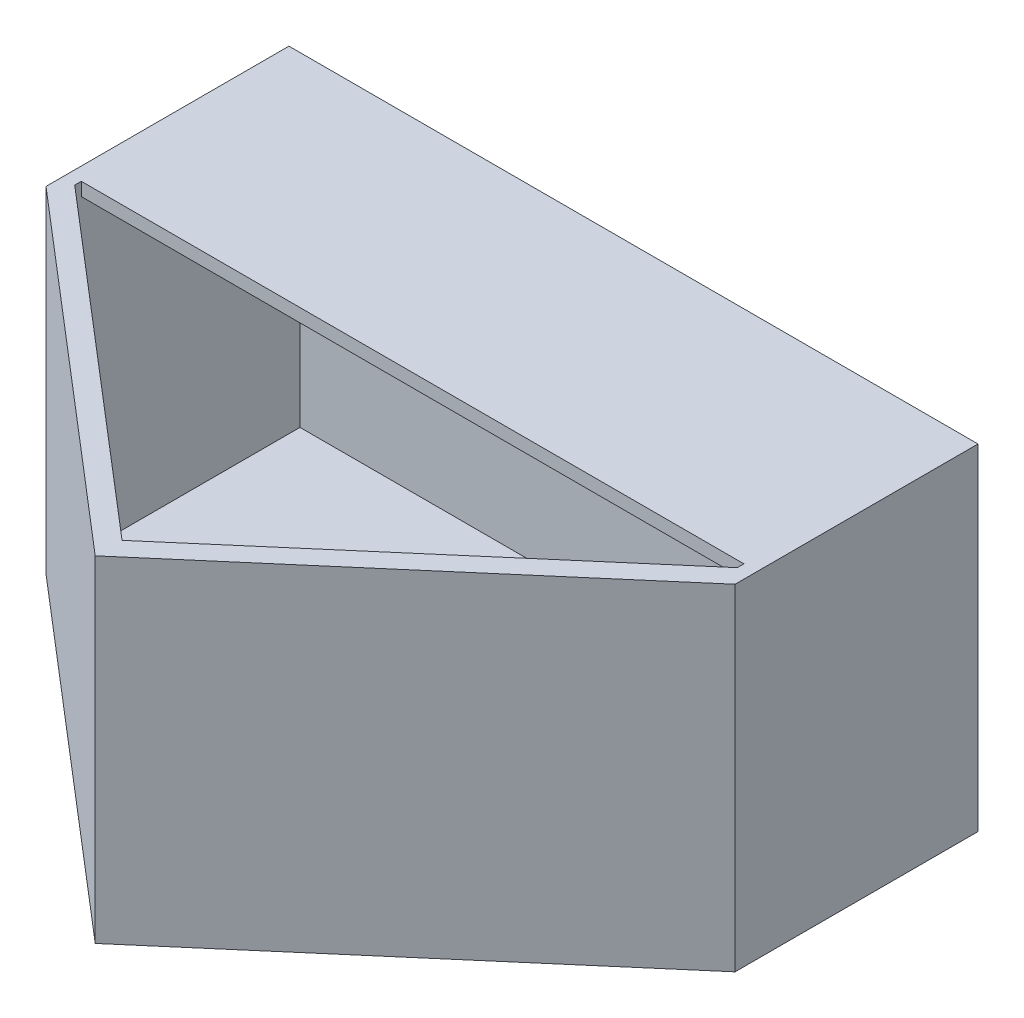
ISO-10303-21;
HEADER;
FILE_DESCRIPTION(('STEP AP214'),'2;1');
FILE_NAME('part.step','',(''),(''),'','','');
FILE_SCHEMA(('AUTOMOTIVE_DESIGN { 1 0 10303 214 1 1 1 1 }'));
ENDSEC;
DATA;
#1=APPLICATION_CONTEXT('core data for automotive mechanical design processes');
#2=APPLICATION_PROTOCOL_DEFINITION('international standard','automotive_design',2000,#1);
#3=PRODUCT_CONTEXT('',#1,'mechanical');
#4=PRODUCT('Part','Part','',(#3));
#5=PRODUCT_RELATED_PRODUCT_CATEGORY('part','',(#4));
#6=PRODUCT_DEFINITION_FORMATION('','',#4);
#7=PRODUCT_DEFINITION_CONTEXT('part definition',#1,'design');
#8=PRODUCT_DEFINITION('design','',#6,#7);
#9=PRODUCT_DEFINITION_SHAPE('','',#8);
#10=(LENGTH_UNIT() NAMED_UNIT(*) SI_UNIT(.MILLI.,.METRE.));
#11=(NAMED_UNIT(*) PLANE_ANGLE_UNIT() SI_UNIT($,.RADIAN.));
#12=(NAMED_UNIT(*) SI_UNIT($,.STERADIAN.) SOLID_ANGLE_UNIT());
#13=UNCERTAINTY_MEASURE_WITH_UNIT(LENGTH_MEASURE(1.E-05),#10,'distance_accuracy_value','');
#14=(GEOMETRIC_REPRESENTATION_CONTEXT(3) GLOBAL_UNCERTAINTY_ASSIGNED_CONTEXT((#13)) GLOBAL_UNIT_ASSIGNED_CONTEXT((#10,
#11,#12)) REPRESENTATION_CONTEXT('',''));
#15=CARTESIAN_POINT('',(0.,0.,0.));
#16=DIRECTION('',(0.,0.,1.));
#17=DIRECTION('',(1.,0.,0.));
#18=AXIS2_PLACEMENT_3D('',#15,#16,#17);
#19=CARTESIAN_POINT('',(-489.308820700797,463.006069764868,1627.20245723625));
#20=DIRECTION('',(0.650791373455967,0.,0.759256602365298));
#21=DIRECTION('',(0.759256602365298,0.,-0.650791373455967));
#22=AXIS2_PLACEMENT_3D('',#19,#20,#21);
#23=PLANE('',#22);
#24=DIRECTION('',(-0.759256602365298,0.,0.650791373455967));
#25=VECTOR('',#24,1.);
#26=CARTESIAN_POINT('',(-404.09321667027,-266.993930235132,1554.16051092437));
#27=LINE('',#26,#25);
#28=CARTESIAN_POINT('',(808.260712741496,-266.993930235132,515.));
#29=VERTEX_POINT('',#28);
#30=CARTESIAN_POINT('',(58.2607127414948,-266.993930235132,1157.85714285714));
#31=VERTEX_POINT('',#30);
#32=EDGE_CURVE('E142',#29,#31,#27,.T.);
#33=ORIENTED_EDGE('',*,*,#32,.T.);
#34=DIRECTION('',(0.,1.,0.));
#35=VECTOR('',#34,1.);
#36=CARTESIAN_POINT('',(58.2607127414948,-296.993930235132,1157.85714285714));
#37=LINE('',#36,#35);
#38=CARTESIAN_POINT('',(58.2607127414949,463.006069764868,1157.85714285714));
#39=VERTEX_POINT('',#38);
#40=EDGE_CURVE('E128',#31,#39,#37,.T.);
#41=ORIENTED_EDGE('',*,*,#40,.T.);
#42=DIRECTION('',(0.759256602365298,0.,-0.650791373455967));
#43=VECTOR('',#42,1.);
#44=CARTESIAN_POINT('',(-489.308820700797,463.006069764868,1627.20245723625));
#45=LINE('',#44,#43);
#46=CARTESIAN_POINT('',(808.260712741496,463.006069764868,515.));
#47=VERTEX_POINT('',#46);
#48=EDGE_CURVE('E168',#39,#47,#45,.T.);
#49=ORIENTED_EDGE('',*,*,#48,.T.);
#50=DIRECTION('',(0.,1.,0.));
#51=VECTOR('',#50,1.);
#52=CARTESIAN_POINT('',(808.260712741496,-296.994930235132,515.));
#53=LINE('',#52,#51);
#54=EDGE_CURVE('E143',#29,#47,#53,.T.);
#55=ORIENTED_EDGE('',*,*,#54,.F.);
#56=EDGE_LOOP('',(#33,#41,#49,#55));
#57=FACE_BOUND('',#56,.T.);
#58=ADVANCED_FACE('F39',(#57),#23,.F.);
#59=CARTESIAN_POINT('',(-691.739287258504,433.006069764868,500.));
#60=DIRECTION('',(1.,0.,0.));
#61=DIRECTION('',(0.,1.,0.));
#62=AXIS2_PLACEMENT_3D('',#59,#60,#61);
#63=PLANE('',#62);
#64=DIRECTION('',(0.,1.,0.));
#65=VECTOR('',#64,1.);
#66=CARTESIAN_POINT('',(-691.739287258504,-296.994930235132,515.));
#67=LINE('',#66,#65);
#68=CARTESIAN_POINT('',(-691.739287258504,-266.993930235132,515.));
#69=VERTEX_POINT('',#68);
#70=CARTESIAN_POINT('',(-691.739287258504,463.006069764868,515.));
#71=VERTEX_POINT('',#70);
#72=EDGE_CURVE('E155',#69,#71,#67,.T.);
#73=ORIENTED_EDGE('',*,*,#72,.F.);
#74=DIRECTION('',(0.,0.,-1.));
#75=VECTOR('',#74,1.);
#76=CARTESIAN_POINT('',(-691.739287258504,-266.993930235132,500.));
#77=LINE('',#76,#75);
#78=CARTESIAN_POINT('',(-691.739287258504,-266.993930235132,4.99999999999995));
#79=VERTEX_POINT('',#78);
#80=EDGE_CURVE('E62',#69,#79,#77,.T.);
#81=ORIENTED_EDGE('',*,*,#80,.T.);
#82=DIRECTION('',(0.,-1.,0.));
#83=VECTOR('',#82,1.);
#84=CARTESIAN_POINT('',(-691.739287258504,433.006069764868,4.99999999999995));
#85=LINE('',#84,#83);
#86=CARTESIAN_POINT('',(-691.739287258504,433.006069764868,4.99999999999995));
#87=VERTEX_POINT('',#86);
#88=EDGE_CURVE('E181',#87,#79,#85,.T.);
#89=ORIENTED_EDGE('',*,*,#88,.F.);
#90=DIRECTION('',(0.,0.,-1.));
#91=VECTOR('',#90,1.);
#92=CARTESIAN_POINT('',(-691.739287258504,433.006069764868,500.));
#93=LINE('',#92,#91);
#94=CARTESIAN_POINT('',(-691.739287258504,433.006069764868,500.));
#95=VERTEX_POINT('',#94);
#96=EDGE_CURVE('E196',#95,#87,#93,.T.);
#97=ORIENTED_EDGE('',*,*,#96,.F.);
#98=DIRECTION('',(0.,1.,0.));
#99=VECTOR('',#98,1.);
#100=CARTESIAN_POINT('',(-691.739287258504,-296.993930235132,500.));
#101=LINE('',#100,#99);
#102=CARTESIAN_POINT('',(-691.739287258504,463.006069764868,500.));
#103=VERTEX_POINT('',#102);
#104=EDGE_CURVE('E158',#95,#103,#101,.T.);
#105=ORIENTED_EDGE('',*,*,#104,.T.);
#106=DIRECTION('',(0.,0.,-1.));
#107=VECTOR('',#106,1.);
#108=CARTESIAN_POINT('',(-691.739287258504,463.006069764868,550.));
#109=LINE('',#108,#107);
#110=EDGE_CURVE('E162',#71,#103,#109,.T.);
#111=ORIENTED_EDGE('',*,*,#110,.F.);
#112=EDGE_LOOP('',(#73,#81,#89,#97,#105,#111));
#113=FACE_BOUND('',#112,.T.);
#114=ADVANCED_FACE('F251',(#113),#63,.T.);
#115=CARTESIAN_POINT('',(808.260712741496,433.006069764868,500.));
#116=DIRECTION('',(-1.,0.,0.));
#117=DIRECTION('',(0.,0.,1.));
#118=AXIS2_PLACEMENT_3D('',#115,#116,#117);
#119=PLANE('',#118);
#120=DIRECTION('',(0.,0.,-1.));
#121=VECTOR('',#120,1.);
#122=CARTESIAN_POINT('',(808.260712741496,-266.993930235132,500.));
#123=LINE('',#122,#121);
#124=CARTESIAN_POINT('',(808.260712741496,-266.993930235132,4.99999999999995));
#125=VERTEX_POINT('',#124);
#126=EDGE_CURVE('E54',#29,#125,#123,.T.);
#127=ORIENTED_EDGE('',*,*,#126,.F.);
#128=ORIENTED_EDGE('',*,*,#54,.T.);
#129=DIRECTION('',(0.,0.,-1.));
#130=VECTOR('',#129,1.);
#131=CARTESIAN_POINT('',(808.260712741496,463.006069764868,550.));
#132=LINE('',#131,#130);
#133=CARTESIAN_POINT('',(808.260712741496,463.006069764868,500.));
#134=VERTEX_POINT('',#133);
#135=EDGE_CURVE('E177',#47,#134,#132,.T.);
#136=ORIENTED_EDGE('',*,*,#135,.T.);
#137=DIRECTION('',(0.,-1.,0.));
#138=VECTOR('',#137,1.);
#139=CARTESIAN_POINT('',(808.260712741496,-296.993930235132,500.));
#140=LINE('',#139,#138);
#141=CARTESIAN_POINT('',(808.260712741496,433.006069764868,500.));
#142=VERTEX_POINT('',#141);
#143=EDGE_CURVE('E173',#134,#142,#140,.T.);
#144=ORIENTED_EDGE('',*,*,#143,.T.);
#145=DIRECTION('',(0.,0.,-1.));
#146=VECTOR('',#145,1.);
#147=CARTESIAN_POINT('',(808.260712741496,433.006069764868,500.));
#148=LINE('',#147,#146);
#149=CARTESIAN_POINT('',(808.260712741496,433.006069764868,4.99999999999995));
#150=VERTEX_POINT('',#149);
#151=EDGE_CURVE('E198',#142,#150,#148,.T.);
#152=ORIENTED_EDGE('',*,*,#151,.T.);
#153=DIRECTION('',(0.,1.,0.));
#154=VECTOR('',#153,1.);
#155=CARTESIAN_POINT('',(808.260712741496,433.006069764868,4.99999999999995));
#156=LINE('',#155,#154);
#157=EDGE_CURVE('E187',#125,#150,#156,.T.);
#158=ORIENTED_EDGE('',*,*,#157,.F.);
#159=EDGE_LOOP('',(#127,#128,#136,#144,#152,#158));
#160=FACE_BOUND('',#159,.T.);
#161=ADVANCED_FACE('F256',(#160),#119,.T.);
#162=CARTESIAN_POINT('',(207.55634890176,-296.993930235132,1285.82483099451));
#163=DIRECTION('',(-0.650791373455968,0.,0.759256602365296));
#164=DIRECTION('',(0.759256602365297,0.,0.650791373455969));
#165=AXIS2_PLACEMENT_3D('',#162,#163,#164);
#166=PLANE('',#165);
#167=DIRECTION('',(-0.759256602365297,0.,-0.650791373455969));
#168=VECTOR('',#167,1.);
#169=CARTESIAN_POINT('',(-344.091240199681,-266.993930235132,812.984040336134));
#170=LINE('',#169,#168);
#171=EDGE_CURVE('E131',#31,#69,#170,.T.);
#172=ORIENTED_EDGE('',*,*,#171,.T.);
#173=ORIENTED_EDGE('',*,*,#72,.T.);
#174=DIRECTION('',(-0.759256602365296,0.,-0.650791373455968));
#175=VECTOR('',#174,1.);
#176=CARTESIAN_POINT('',(207.55634890176,463.006069764868,1285.82483099451));
#177=LINE('',#176,#175);
#178=EDGE_CURVE('E134',#39,#71,#177,.T.);
#179=ORIENTED_EDGE('',*,*,#178,.F.);
#180=ORIENTED_EDGE('',*,*,#40,.F.);
#181=EDGE_LOOP('',(#172,#173,#179,#180));
#182=FACE_BOUND('',#181,.T.);
#183=ADVANCED_FACE('F130',(#182),#166,.F.);
#184=CARTESIAN_POINT('',(0.,0.,500.));
#185=DIRECTION('',(0.,0.,1.));
#186=DIRECTION('',(1.,0.,0.));
#187=AXIS2_PLACEMENT_3D('',#184,#185,#186);
#188=PLANE('',#187);
#189=DIRECTION('',(-1.,0.,0.));
#190=VECTOR('',#189,1.);
#191=CARTESIAN_POINT('',(-721.739287258504,463.006069764868,500.));
#192=LINE('',#191,#190);
#193=EDGE_CURVE('E204',#134,#103,#192,.T.);
#194=ORIENTED_EDGE('',*,*,#193,.T.);
#195=ORIENTED_EDGE('',*,*,#104,.F.);
#196=DIRECTION('',(-1.,0.,0.));
#197=VECTOR('',#196,1.);
#198=CARTESIAN_POINT('',(-691.739287258504,433.006069764868,500.));
#199=LINE('',#198,#197);
#200=EDGE_CURVE('E193',#142,#95,#199,.T.);
#201=ORIENTED_EDGE('',*,*,#200,.F.);
#202=ORIENTED_EDGE('',*,*,#143,.F.);
#203=EDGE_LOOP('',(#194,#195,#201,#202));
#204=FACE_BOUND('',#203,.T.);
#205=ADVANCED_FACE('F276',(#204),#188,.T.);
#206=CARTESIAN_POINT('',(0.,0.,0.));
#207=DIRECTION('',(0.,0.,1.));
#208=DIRECTION('',(1.,0.,0.));
#209=AXIS2_PLACEMENT_3D('',#206,#207,#208);
#210=PLANE('',#209);
#211=DIRECTION('',(0.,-1.,0.));
#212=VECTOR('',#211,1.);
#213=CARTESIAN_POINT('',(-721.739287258504,463.006069764868,0.));
#214=LINE('',#213,#212);
#215=CARTESIAN_POINT('',(-721.739287258504,463.006069764868,0.));
#216=VERTEX_POINT('',#215);
#217=CARTESIAN_POINT('',(-721.739287258504,-296.993930235132,0.));
#218=VERTEX_POINT('',#217);
#219=EDGE_CURVE('E203',#216,#218,#214,.T.);
#220=ORIENTED_EDGE('',*,*,#219,.F.);
#221=DIRECTION('',(-1.,0.,0.));
#222=VECTOR('',#221,1.);
#223=CARTESIAN_POINT('',(-721.739287258504,463.006069764868,0.));
#224=LINE('',#223,#222);
#225=CARTESIAN_POINT('',(838.260712741496,463.006069764868,0.));
#226=VERTEX_POINT('',#225);
#227=EDGE_CURVE('E208',#226,#216,#224,.T.);
#228=ORIENTED_EDGE('',*,*,#227,.F.);
#229=DIRECTION('',(0.,1.,0.));
#230=VECTOR('',#229,1.);
#231=CARTESIAN_POINT('',(838.260712741496,463.006069764868,0.));
#232=LINE('',#231,#230);
#233=CARTESIAN_POINT('',(838.260712741496,-296.993930235132,0.));
#234=VERTEX_POINT('',#233);
#235=EDGE_CURVE('E213',#234,#226,#232,.T.);
#236=ORIENTED_EDGE('',*,*,#235,.F.);
#237=DIRECTION('',(1.,0.,0.));
#238=VECTOR('',#237,1.);
#239=CARTESIAN_POINT('',(-721.739287258504,-296.993930235132,0.));
#240=LINE('',#239,#238);
#241=EDGE_CURVE('E211',#218,#234,#240,.T.);
#242=ORIENTED_EDGE('',*,*,#241,.F.);
#243=EDGE_LOOP('',(#220,#228,#236,#242));
#244=FACE_BOUND('',#243,.T.);
#245=ADVANCED_FACE('F232',(#244),#210,.F.);
#246=CARTESIAN_POINT('',(-721.739287258504,463.006069764868,500.));
#247=DIRECTION('',(1.,0.,0.));
#248=DIRECTION('',(0.,1.,0.));
#249=AXIS2_PLACEMENT_3D('',#246,#247,#248);
#250=PLANE('',#249);
#251=ORIENTED_EDGE('',*,*,#219,.T.);
#252=DIRECTION('',(0.,0.,-1.));
#253=VECTOR('',#252,1.);
#254=CARTESIAN_POINT('',(-721.739287258504,-296.993930235132,500.));
#255=LINE('',#254,#253);
#256=CARTESIAN_POINT('',(-721.739287258504,-296.993930235132,550.));
#257=VERTEX_POINT('',#256);
#258=EDGE_CURVE('E11',#257,#218,#255,.T.);
#259=ORIENTED_EDGE('',*,*,#258,.F.);
#260=DIRECTION('',(0.,-1.,0.));
#261=VECTOR('',#260,1.);
#262=CARTESIAN_POINT('',(-721.739287258504,-296.993930235132,550.));
#263=LINE('',#262,#261);
#264=CARTESIAN_POINT('',(-721.739287258504,463.006069764868,550.));
#265=VERTEX_POINT('',#264);
#266=EDGE_CURVE('E159',#265,#257,#263,.T.);
#267=ORIENTED_EDGE('',*,*,#266,.F.);
#268=DIRECTION('',(0.,0.,-1.));
#269=VECTOR('',#268,1.);
#270=CARTESIAN_POINT('',(-721.739287258504,463.006069764868,500.));
#271=LINE('',#270,#269);
#272=EDGE_CURVE('E207',#265,#216,#271,.T.);
#273=ORIENTED_EDGE('',*,*,#272,.T.);
#274=EDGE_LOOP('',(#251,#259,#267,#273));
#275=FACE_BOUND('',#274,.T.);
#276=ADVANCED_FACE('F41',(#275),#250,.F.);
#277=CARTESIAN_POINT('',(-721.739287258504,-296.993930235132,500.));
#278=DIRECTION('',(0.,1.,0.));
#279=DIRECTION('',(0.,0.,1.));
#280=AXIS2_PLACEMENT_3D('',#277,#278,#279);
#281=PLANE('',#280);
#282=DIRECTION('',(0.759256602365298,0.,-0.650791373455967));
#283=VECTOR('',#282,1.);
#284=CARTESIAN_POINT('',(-459.308820700797,-296.993930235132,1662.20245723625));
#285=LINE('',#284,#283);
#286=CARTESIAN_POINT('',(58.2607127414949,-296.993930235132,1218.57142857143));
#287=VERTEX_POINT('',#286);
#288=CARTESIAN_POINT('',(838.260712741496,-296.993930235132,550.));
#289=VERTEX_POINT('',#288);
#290=EDGE_CURVE('E166',#287,#289,#285,.T.);
#291=ORIENTED_EDGE('',*,*,#290,.F.);
#292=DIRECTION('',(-0.759256602365296,0.,-0.650791373455968));
#293=VECTOR('',#292,1.);
#294=CARTESIAN_POINT('',(177.55634890176,-296.993930235132,1320.82483099451));
#295=LINE('',#294,#293);
#296=EDGE_CURVE('E138',#287,#257,#295,.T.);
#297=ORIENTED_EDGE('',*,*,#296,.T.);
#298=ORIENTED_EDGE('',*,*,#258,.T.);
#299=ORIENTED_EDGE('',*,*,#241,.T.);
#300=DIRECTION('',(0.,0.,-1.));
#301=VECTOR('',#300,1.);
#302=CARTESIAN_POINT('',(838.260712741496,-296.993930235132,500.));
#303=LINE('',#302,#301);
#304=EDGE_CURVE('E47',#289,#234,#303,.T.);
#305=ORIENTED_EDGE('',*,*,#304,.F.);
#306=EDGE_LOOP('',(#291,#297,#298,#299,#305));
#307=FACE_BOUND('',#306,.T.);
#308=ADVANCED_FACE('F243',(#307),#281,.F.);
#309=CARTESIAN_POINT('',(838.260712741496,463.006069764868,500.));
#310=DIRECTION('',(-1.,0.,0.));
#311=DIRECTION('',(0.,-1.,0.));
#312=AXIS2_PLACEMENT_3D('',#309,#310,#311);
#313=PLANE('',#312);
#314=ORIENTED_EDGE('',*,*,#235,.T.);
#315=DIRECTION('',(0.,0.,-1.));
#316=VECTOR('',#315,1.);
#317=CARTESIAN_POINT('',(838.260712741496,463.006069764868,500.));
#318=LINE('',#317,#316);
#319=CARTESIAN_POINT('',(838.260712741496,463.006069764868,550.));
#320=VERTEX_POINT('',#319);
#321=EDGE_CURVE('E218',#320,#226,#318,.T.);
#322=ORIENTED_EDGE('',*,*,#321,.F.);
#323=DIRECTION('',(0.,1.,0.));
#324=VECTOR('',#323,1.);
#325=CARTESIAN_POINT('',(838.260712741496,-296.993930235132,550.));
#326=LINE('',#325,#324);
#327=EDGE_CURVE('E174',#289,#320,#326,.T.);
#328=ORIENTED_EDGE('',*,*,#327,.F.);
#329=ORIENTED_EDGE('',*,*,#304,.T.);
#330=EDGE_LOOP('',(#314,#322,#328,#329));
#331=FACE_BOUND('',#330,.T.);
#332=ADVANCED_FACE('F225',(#331),#313,.F.);
#333=CARTESIAN_POINT('',(-721.739287258504,463.006069764868,500.));
#334=DIRECTION('',(0.,-1.,0.));
#335=DIRECTION('',(0.,0.,-1.));
#336=AXIS2_PLACEMENT_3D('',#333,#334,#335);
#337=PLANE('',#336);
#338=ORIENTED_EDGE('',*,*,#48,.F.);
#339=ORIENTED_EDGE('',*,*,#178,.T.);
#340=ORIENTED_EDGE('',*,*,#110,.T.);
#341=ORIENTED_EDGE('',*,*,#193,.F.);
#342=ORIENTED_EDGE('',*,*,#135,.F.);
#343=EDGE_LOOP('',(#338,#339,#340,#341,#342));
#344=FACE_BOUND('',#343,.T.);
#345=DIRECTION('',(-0.759256602365296,0.,-0.650791373455968));
#346=VECTOR('',#345,1.);
#347=CARTESIAN_POINT('',(177.55634890176,463.006069764868,1320.82483099451));
#348=LINE('',#347,#346);
#349=CARTESIAN_POINT('',(58.2607127414949,463.006069764868,1218.57142857143));
#350=VERTEX_POINT('',#349);
#351=EDGE_CURVE('E153',#350,#265,#348,.T.);
#352=ORIENTED_EDGE('',*,*,#351,.F.);
#353=DIRECTION('',(0.759256602365298,0.,-0.650791373455967));
#354=VECTOR('',#353,1.);
#355=CARTESIAN_POINT('',(-459.308820700797,463.006069764868,1662.20245723625));
#356=LINE('',#355,#354);
#357=EDGE_CURVE('E170',#350,#320,#356,.T.);
#358=ORIENTED_EDGE('',*,*,#357,.T.);
#359=ORIENTED_EDGE('',*,*,#321,.T.);
#360=ORIENTED_EDGE('',*,*,#227,.T.);
#361=ORIENTED_EDGE('',*,*,#272,.F.);
#362=EDGE_LOOP('',(#352,#358,#359,#360,#361));
#363=FACE_BOUND('',#362,.T.);
#364=ADVANCED_FACE('F234',(#344,#363),#337,.F.);
#365=CARTESIAN_POINT('',(-691.739287258504,-266.993930235132,500.));
#366=DIRECTION('',(0.,1.,0.));
#367=DIRECTION('',(0.,0.,1.));
#368=AXIS2_PLACEMENT_3D('',#365,#366,#367);
#369=PLANE('',#368);
#370=DIRECTION('',(1.,0.,0.));
#371=VECTOR('',#370,1.);
#372=CARTESIAN_POINT('',(-691.739287258504,-266.993930235132,4.99999999999995));
#373=LINE('',#372,#371);
#374=EDGE_CURVE('E184',#79,#125,#373,.T.);
#375=ORIENTED_EDGE('',*,*,#374,.F.);
#376=ORIENTED_EDGE('',*,*,#80,.F.);
#377=ORIENTED_EDGE('',*,*,#171,.F.);
#378=ORIENTED_EDGE('',*,*,#32,.F.);
#379=ORIENTED_EDGE('',*,*,#126,.T.);
#380=EDGE_LOOP('',(#375,#376,#377,#378,#379));
#381=FACE_BOUND('',#380,.T.);
#382=ADVANCED_FACE('F145',(#381),#369,.T.);
#383=CARTESIAN_POINT('',(-691.739287258504,433.006069764868,500.));
#384=DIRECTION('',(0.,-1.,0.));
#385=DIRECTION('',(0.,0.,-1.));
#386=AXIS2_PLACEMENT_3D('',#383,#384,#385);
#387=PLANE('',#386);
#388=DIRECTION('',(-1.,0.,0.));
#389=VECTOR('',#388,1.);
#390=CARTESIAN_POINT('',(-691.739287258504,433.006069764868,4.99999999999995));
#391=LINE('',#390,#389);
#392=EDGE_CURVE('E190',#150,#87,#391,.T.);
#393=ORIENTED_EDGE('',*,*,#392,.F.);
#394=ORIENTED_EDGE('',*,*,#151,.F.);
#395=ORIENTED_EDGE('',*,*,#200,.T.);
#396=ORIENTED_EDGE('',*,*,#96,.T.);
#397=EDGE_LOOP('',(#393,#394,#395,#396));
#398=FACE_BOUND('',#397,.T.);
#399=ADVANCED_FACE('F267',(#398),#387,.T.);
#400=CARTESIAN_POINT('',(0.,0.,4.99999999999995));
#401=DIRECTION('',(0.,0.,1.));
#402=DIRECTION('',(1.,0.,0.));
#403=AXIS2_PLACEMENT_3D('',#400,#401,#402);
#404=PLANE('',#403);
#405=ORIENTED_EDGE('',*,*,#88,.T.);
#406=ORIENTED_EDGE('',*,*,#374,.T.);
#407=ORIENTED_EDGE('',*,*,#157,.T.);
#408=ORIENTED_EDGE('',*,*,#392,.T.);
#409=EDGE_LOOP('',(#405,#406,#407,#408));
#410=FACE_BOUND('',#409,.T.);
#411=ADVANCED_FACE('F264',(#410),#404,.T.);
#412=CARTESIAN_POINT('',(-459.308820700797,463.006069764868,1662.20245723625));
#413=DIRECTION('',(-0.650791373455967,0.,-0.759256602365298));
#414=DIRECTION('',(-0.759256602365298,0.,0.650791373455967));
#415=AXIS2_PLACEMENT_3D('',#412,#413,#414);
#416=PLANE('',#415);
#417=ORIENTED_EDGE('',*,*,#357,.F.);
#418=DIRECTION('',(0.,1.,0.));
#419=VECTOR('',#418,1.);
#420=CARTESIAN_POINT('',(58.2607127414949,-559.993930235132,1218.57142857143));
#421=LINE('',#420,#419);
#422=EDGE_CURVE('E139',#287,#350,#421,.T.);
#423=ORIENTED_EDGE('',*,*,#422,.F.);
#424=ORIENTED_EDGE('',*,*,#290,.T.);
#425=ORIENTED_EDGE('',*,*,#327,.T.);
#426=EDGE_LOOP('',(#417,#423,#424,#425));
#427=FACE_BOUND('',#426,.T.);
#428=ADVANCED_FACE('F242',(#427),#416,.F.);
#429=CARTESIAN_POINT('',(177.55634890176,-296.993930235132,1320.82483099451));
#430=DIRECTION('',(0.650791373455968,0.,-0.759256602365296));
#431=DIRECTION('',(-0.759256602365297,0.,-0.650791373455969));
#432=AXIS2_PLACEMENT_3D('',#429,#430,#431);
#433=PLANE('',#432);
#434=ORIENTED_EDGE('',*,*,#296,.F.);
#435=ORIENTED_EDGE('',*,*,#422,.T.);
#436=ORIENTED_EDGE('',*,*,#351,.T.);
#437=ORIENTED_EDGE('',*,*,#266,.T.);
#438=EDGE_LOOP('',(#434,#435,#436,#437));
#439=FACE_BOUND('',#438,.T.);
#440=ADVANCED_FACE('F238',(#439),#433,.F.);
#441=CLOSED_SHELL('',(#58,#114,#161,#183,#205,#245,#276,#308,#332,#364,#382,#399,#411,#428,#440));
#442=MANIFOLD_SOLID_BREP('B2',#441);
#443=ADVANCED_BREP_SHAPE_REPRESENTATION('',(#18,#442),#14);
#444=SHAPE_DEFINITION_REPRESENTATION(#9,#443);
ENDSEC;
END-ISO-10303-21;
